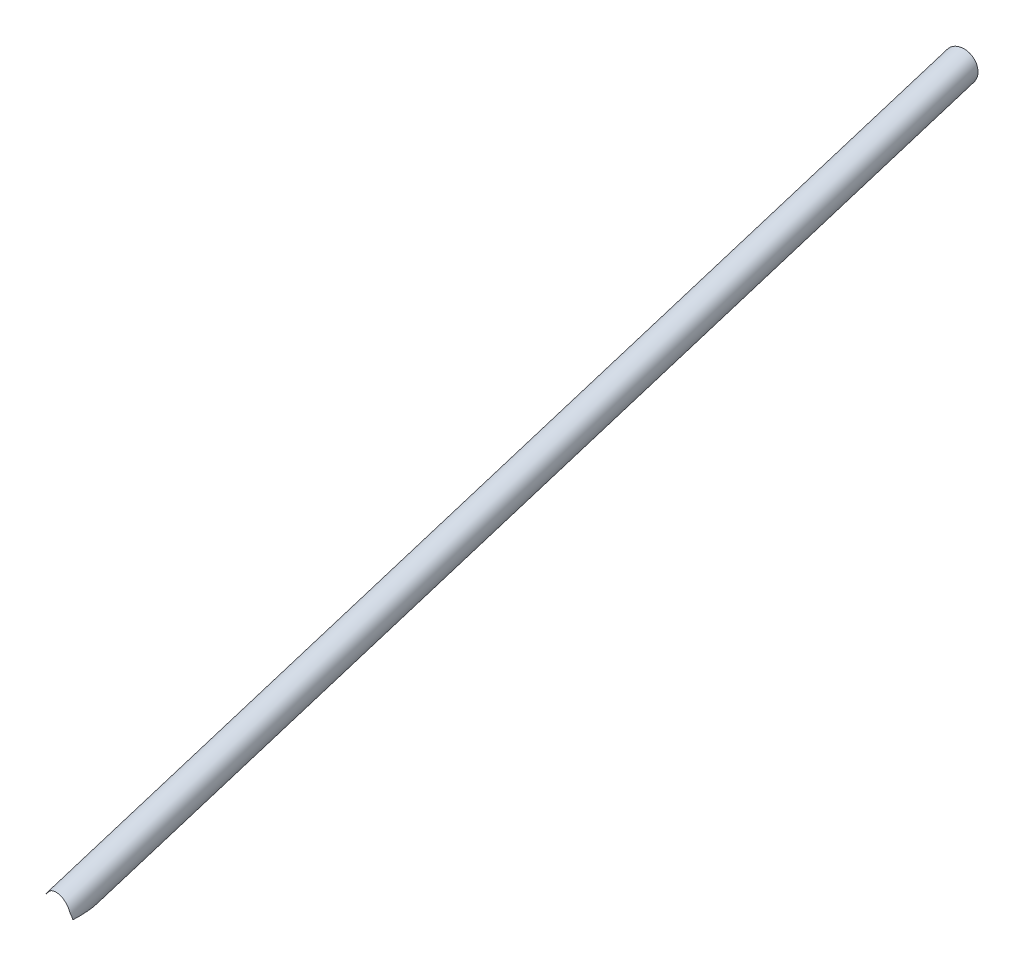
ISO-10303-21;
HEADER;
FILE_DESCRIPTION(('STEP AP214'),'2;1');
FILE_NAME('part.step','',(''),(''),'','','');
FILE_SCHEMA(('AUTOMOTIVE_DESIGN { 1 0 10303 214 1 1 1 1 }'));
ENDSEC;
DATA;
#1=APPLICATION_CONTEXT('core data for automotive mechanical design processes');
#2=APPLICATION_PROTOCOL_DEFINITION('international standard','automotive_design',2000,#1);
#3=PRODUCT_CONTEXT('',#1,'mechanical');
#4=PRODUCT('Part','Part','',(#3));
#5=PRODUCT_RELATED_PRODUCT_CATEGORY('part','',(#4));
#6=PRODUCT_DEFINITION_FORMATION('','',#4);
#7=PRODUCT_DEFINITION_CONTEXT('part definition',#1,'design');
#8=PRODUCT_DEFINITION('design','',#6,#7);
#9=PRODUCT_DEFINITION_SHAPE('','',#8);
#10=(LENGTH_UNIT() NAMED_UNIT(*) SI_UNIT(.MILLI.,.METRE.));
#11=(NAMED_UNIT(*) PLANE_ANGLE_UNIT() SI_UNIT($,.RADIAN.));
#12=(NAMED_UNIT(*) SI_UNIT($,.STERADIAN.) SOLID_ANGLE_UNIT());
#13=UNCERTAINTY_MEASURE_WITH_UNIT(LENGTH_MEASURE(1.E-05),#10,'distance_accuracy_value','');
#14=(GEOMETRIC_REPRESENTATION_CONTEXT(3) GLOBAL_UNCERTAINTY_ASSIGNED_CONTEXT((#13)) GLOBAL_UNIT_ASSIGNED_CONTEXT((#10,
#11,#12)) REPRESENTATION_CONTEXT('',''));
#15=CARTESIAN_POINT('',(0.,0.,0.));
#16=DIRECTION('',(0.,0.,1.));
#17=DIRECTION('',(1.,0.,0.));
#18=AXIS2_PLACEMENT_3D('',#15,#16,#17);
#19=CARTESIAN_POINT('',(-160.,500.,-1140.));
#20=DIRECTION('',(-0.0860700691861797,-0.397246473166983,0.913666888284061));
#21=DIRECTION('',(0.,-0.917070056253235,-0.39872611141445));
#22=AXIS2_PLACEMENT_3D('',#19,#20,#21);
#23=CYLINDRICAL_SURFACE('',#22,11.3);
#24=CARTESIAN_POINT('',(-160.,500.,-1140.));
#25=DIRECTION('',(-0.133991346812806,0.0219122293107186,-0.990740214781819));
#26=DIRECTION('',(-0.480296136468892,-0.875921056969801,0.0455842434396289));
#27=AXIS2_PLACEMENT_3D('',#24,#25,#26);
#28=ELLIPSE('',#27,12.5224622988998,11.3);
#29=CARTESIAN_POINT('',(-166.014490261239,489.031311587283,-1139.4291730301));
#30=VERTEX_POINT('',#29);
#31=EDGE_CURVE('E103',#30,#30,#28,.T.);
#32=ORIENTED_EDGE('',*,*,#31,.T.);
#33=EDGE_LOOP('',(#32));
#34=FACE_BOUND('',#33,.T.);
#35=CARTESIAN_POINT('',(-219.876049960594,213.286108546211,-508.89830547729));
#36=CARTESIAN_POINT('',(-219.744983221446,213.103990623124,-508.47944079388));
#37=CARTESIAN_POINT('',(-219.619745346317,212.924703354233,-508.057517587089));
#38=CARTESIAN_POINT('',(-219.378911944815,212.570958780361,-507.208904454206));
#39=CARTESIAN_POINT('',(-219.26331728065,212.396501908199,-506.78221410574));
#40=CARTESIAN_POINT('',(-219.04028242253,212.051767564359,-505.924884196033));
#41=CARTESIAN_POINT('',(-218.932844658474,211.881491348218,-505.494243500491));
#42=CARTESIAN_POINT('',(-218.725033339016,211.544695304599,-504.629791739642));
#43=CARTESIAN_POINT('',(-218.624660021078,211.378175603521,-504.195980568303));
#44=CARTESIAN_POINT('',(-218.429946994662,211.048271186261,-503.32501231813));
#45=CARTESIAN_POINT('',(-218.335616992411,210.884891794424,-502.887851059884));
#46=CARTESIAN_POINT('',(-218.152456909951,210.561245639945,-502.011227040914));
#47=CARTESIAN_POINT('',(-218.063626926709,210.400978932214,-501.571764239762));
#48=CARTESIAN_POINT('',(-217.804525528881,209.924546692681,-500.250546260107));
#49=CARTESIAN_POINT('',(-217.641605085443,209.612684743305,-499.36579097204));
#50=CARTESIAN_POINT('',(-217.332053099736,208.999574907086,-497.591341510518));
#51=CARTESIAN_POINT('',(-217.185397533481,208.698311827055,-496.701656715531));
#52=CARTESIAN_POINT('',(-216.905547759232,208.105089343523,-494.917054244897));
#53=CARTESIAN_POINT('',(-216.772354080109,207.813130305853,-494.022136365121));
#54=CARTESIAN_POINT('',(-216.517570444801,207.238328944722,-492.228559205508));
#55=CARTESIAN_POINT('',(-216.395971147722,206.955479406063,-491.329903556707));
#56=CARTESIAN_POINT('',(-216.162677298762,206.398554053049,-489.528621906422));
#57=CARTESIAN_POINT('',(-216.050982567507,206.12447807986,-488.62599597715));
#58=CARTESIAN_POINT('',(-215.800126001738,205.494892970526,-486.513748016538));
#59=CARTESIAN_POINT('',(-215.664313620349,205.142896406478,-485.302680033244));
#60=CARTESIAN_POINT('',(-215.405081735264,204.456347723635,-482.874033184217));
#61=CARTESIAN_POINT('',(-215.281664565608,204.121798895961,-481.656453137545));
#62=CARTESIAN_POINT('',(-215.103815080915,203.635712769231,-479.825583797999));
#63=CARTESIAN_POINT('',(-215.04575991263,203.476349455546,-479.214716304721));
#64=CARTESIAN_POINT('',(-214.931688797713,203.163516169446,-477.991286220898));
#65=CARTESIAN_POINT('',(-214.875672833209,203.010046145387,-477.378723645257));
#66=CARTESIAN_POINT('',(-214.765285206241,202.709902179022,-476.151867048996));
#67=CARTESIAN_POINT('',(-214.710913337557,202.563227383148,-475.537573256179));
#68=CARTESIAN_POINT('',(-214.603355653244,202.277887615788,-474.307030949214));
#69=CARTESIAN_POINT('',(-214.550169817021,202.139222505161,-473.690782469218));
#70=CARTESIAN_POINT('',(-214.441261806551,201.86349359177,-472.418706701254));
#71=CARTESIAN_POINT('',(-214.385581197601,201.72703582032,-471.762743573419));
#72=CARTESIAN_POINT('',(-214.274236447711,201.467961415602,-470.44798998492));
#73=CARTESIAN_POINT('',(-214.218572309512,201.34534642842,-469.789199197659));
#74=CARTESIAN_POINT('',(-214.106383579729,201.118258951356,-468.468202374617));
#75=CARTESIAN_POINT('',(-214.049858632288,201.013794199088,-467.805995005582));
#76=CARTESIAN_POINT('',(-213.963740687105,200.875921294725,-466.810249309681));
#77=CARTESIAN_POINT('',(-213.934815471176,200.833103875561,-466.477956704485));
#78=CARTESIAN_POINT('',(-213.876406404185,200.754984265097,-465.812545122427));
#79=CARTESIAN_POINT('',(-213.846922580454,200.719681707149,-465.479426186685));
#80=CARTESIAN_POINT('',(-213.782106010479,200.652727034682,-464.754274182321));
#81=CARTESIAN_POINT('',(-213.746649318281,200.622782938346,-464.362089961271));
#82=CARTESIAN_POINT('',(-213.674779088304,200.578554440055,-463.576958501132));
#83=CARTESIAN_POINT('',(-213.638365751688,200.564266772439,-463.184011438295));
#84=CARTESIAN_POINT('',(-213.56474936776,200.555655415265,-462.398044000887));
#85=CARTESIAN_POINT('',(-213.527546605193,200.561324644988,-462.005023701781));
#86=CARTESIAN_POINT('',(-213.452948517691,200.598298999997,-461.220186184778));
#87=CARTESIAN_POINT('',(-213.415553282612,200.629593080746,-460.82836852155));
#88=CARTESIAN_POINT('',(-213.354377838602,200.709052667958,-460.178870506829));
#89=CARTESIAN_POINT('',(-213.330223675209,200.748086090363,-459.92011812872));
#90=CARTESIAN_POINT('',(-213.283333653861,200.843111386252,-459.405548398941));
#91=CARTESIAN_POINT('',(-213.260597780996,200.899103081427,-459.14973101644));
#92=CARTESIAN_POINT('',(-213.217805694454,201.030237533156,-458.643442794107));
#93=CARTESIAN_POINT('',(-213.197742930547,201.105332113742,-458.392960197588));
#94=CARTESIAN_POINT('',(-213.161904914827,201.276685163148,-457.898998284789));
#95=CARTESIAN_POINT('',(-213.146128592518,201.372938336937,-457.655517233551));
#96=CARTESIAN_POINT('',(-213.122904089955,201.571136150238,-457.214801378819));
#97=CARTESIAN_POINT('',(-213.11454948026,201.669941378793,-457.016202982964));
#98=CARTESIAN_POINT('',(-213.10386721278,201.88328298806,-456.627486220911));
#99=CARTESIAN_POINT('',(-213.101538519408,201.997816662184,-456.437366403139));
#100=CARTESIAN_POINT('',(-213.104358206987,202.241754215438,-456.066871162022));
#101=CARTESIAN_POINT('',(-213.109509415052,202.371163700022,-455.886499449812));
#102=CARTESIAN_POINT('',(-213.128625571324,202.643204004896,-455.536511931585));
#103=CARTESIAN_POINT('',(-213.1425909708,202.785835501808,-455.366896676765));
#104=CARTESIAN_POINT('',(-213.180368446752,203.081676791198,-455.039472386284));
#105=CARTESIAN_POINT('',(-213.20414476173,203.234846498735,-454.881622905517));
#106=CARTESIAN_POINT('',(-213.26235586334,203.549931764342,-454.577037676503));
#107=CARTESIAN_POINT('',(-213.296790793106,203.711847439836,-454.430302077536));
#108=CARTESIAN_POINT('',(-213.376900000913,204.042282466348,-454.147467958357));
#109=CARTESIAN_POINT('',(-213.42258383392,204.210807328447,-454.011378611384));
#110=CARTESIAN_POINT('',(-213.525491295265,204.552196973546,-453.749406483292));
#111=CARTESIAN_POINT('',(-213.582715572356,204.725062000053,-453.623524276533));
#112=CARTESIAN_POINT('',(-213.715474718343,205.091527176439,-453.368566218417));
#113=CARTESIAN_POINT('',(-213.792302821077,205.285394900929,-453.240548516363));
#114=CARTESIAN_POINT('',(-213.960186462241,205.673780980482,-452.995306225191));
#115=CARTESIAN_POINT('',(-214.051242665361,205.868299365527,-452.878082140723));
#116=CARTESIAN_POINT('',(-214.24740563176,206.256039630434,-452.653602138816));
#117=CARTESIAN_POINT('',(-214.352514726597,206.449261289553,-452.546347880517));
#118=CARTESIAN_POINT('',(-214.576461082975,206.832671651858,-452.341130201842));
#119=CARTESIAN_POINT('',(-214.695299819786,207.022860026609,-452.24316778195));
#120=CARTESIAN_POINT('',(-214.969723631708,207.433775928185,-452.038495134482));
#121=CARTESIAN_POINT('',(-215.128027671311,207.653579840005,-451.933563536698));
#122=CARTESIAN_POINT('',(-215.462555499854,208.084610761703,-451.735254015726));
#123=CARTESIAN_POINT('',(-215.638781158982,208.29583687323,-451.641877300594));
#124=CARTESIAN_POINT('',(-216.008251037447,208.707902448154,-451.466130738983));
#125=CARTESIAN_POINT('',(-216.201502624309,208.90873735477,-451.383765696713));
#126=CARTESIAN_POINT('',(-216.603858336084,209.29826890404,-451.229760059687));
#127=CARTESIAN_POINT('',(-216.812962772296,209.486965308197,-451.15811967561));
#128=CARTESIAN_POINT('',(-217.261572552873,209.864018482549,-451.02055888517));
#129=CARTESIAN_POINT('',(-217.502182865505,210.051352624773,-450.955433322352));
#130=CARTESIAN_POINT('',(-217.998649508044,210.408864902307,-450.837279822074));
#131=CARTESIAN_POINT('',(-218.254506663411,210.579042107401,-450.784252540361));
#132=CARTESIAN_POINT('',(-218.779730460772,210.900950763227,-450.690413896198));
#133=CARTESIAN_POINT('',(-219.04909782561,211.052681225502,-450.649603188194));
#134=CARTESIAN_POINT('',(-219.599465829415,211.33662690283,-450.580466933131));
#135=CARTESIAN_POINT('',(-219.880466404608,211.468842224848,-450.552141317638));
#136=CARTESIAN_POINT('',(-220.456010448877,211.714596131859,-450.508087907376));
#137=CARTESIAN_POINT('',(-220.75068576435,211.827857624966,-450.492535861839));
#138=CARTESIAN_POINT('',(-221.347817510827,212.032907671322,-450.475264989343));
#139=CARTESIAN_POINT('',(-221.650274095314,212.124695800655,-450.473546435457));
#140=CARTESIAN_POINT('',(-222.26080600569,212.286519022599,-450.48471478705));
#141=CARTESIAN_POINT('',(-222.568883293567,212.356546359303,-450.497606892421));
#142=CARTESIAN_POINT('',(-223.188157389216,212.474806432573,-450.538989165288));
#143=CARTESIAN_POINT('',(-223.499354130811,212.523039630491,-450.567479002573));
#144=CARTESIAN_POINT('',(-224.12088345176,212.597898177508,-450.64112373476));
#145=CARTESIAN_POINT('',(-224.431213254372,212.624623647218,-450.686199971337));
#146=CARTESIAN_POINT('',(-225.049820005669,212.657613314589,-450.794560798362));
#147=CARTESIAN_POINT('',(-225.358096786274,212.66387585703,-450.857846861327));
#148=CARTESIAN_POINT('',(-225.96944806192,212.657219053458,-451.004432400901));
#149=CARTESIAN_POINT('',(-226.272525862467,212.644312389888,-451.087718614753));
#150=CARTESIAN_POINT('',(-226.870404952932,212.601255073978,-451.2765081922));
#151=CARTESIAN_POINT('',(-227.165208652532,212.571109497994,-451.382005009647));
#152=CARTESIAN_POINT('',(-227.673500017961,212.505324655486,-451.589314604247));
#153=CARTESIAN_POINT('',(-227.889515928935,212.472742550823,-451.685929545593));
#154=CARTESIAN_POINT('',(-228.312869229701,212.400816261149,-451.894413233523));
#155=CARTESIAN_POINT('',(-228.520208673324,212.361473687815,-452.006278343197));
#156=CARTESIAN_POINT('',(-228.924018267572,212.278012958143,-452.245967320095));
#157=CARTESIAN_POINT('',(-229.120504940473,212.233902381371,-452.373765906518));
#158=CARTESIAN_POINT('',(-229.501018247845,212.143096251854,-452.645970708164));
#159=CARTESIAN_POINT('',(-229.685044948172,212.096400712774,-452.790376835595));
#160=CARTESIAN_POINT('',(-230.039950544015,212.002572701807,-453.096678874909));
#161=CARTESIAN_POINT('',(-230.210738942004,211.955439334162,-453.258679607883));
#162=CARTESIAN_POINT('',(-230.536414417563,211.863507485884,-453.598532634346));
#163=CARTESIAN_POINT('',(-230.691302584016,211.818708845466,-453.7763838408));
#164=CARTESIAN_POINT('',(-230.984363659839,211.733624574822,-454.146228168456));
#165=CARTESIAN_POINT('',(-231.122543057678,211.693337193203,-454.338215753218));
#166=CARTESIAN_POINT('',(-231.382315097609,211.618843312766,-454.734200413158));
#167=CARTESIAN_POINT('',(-231.503905120753,211.584637773824,-454.938199377301));
#168=CARTESIAN_POINT('',(-231.761099371245,211.515199665562,-455.410565327683));
#169=CARTESIAN_POINT('',(-231.892020340293,211.482048927363,-455.681786107978));
#170=CARTESIAN_POINT('',(-232.131475932484,211.427406034395,-456.235023458243));
#171=CARTESIAN_POINT('',(-232.240001267101,211.405918710994,-456.51704445031));
#172=CARTESIAN_POINT('',(-232.438393944241,211.373905980006,-457.089399075528));
#173=CARTESIAN_POINT('',(-232.528182925639,211.363425899724,-457.379762061718));
#174=CARTESIAN_POINT('',(-232.6508718246,211.355163750562,-457.81865466125));
#175=CARTESIAN_POINT('',(-232.689766290868,211.353652511594,-457.965497854941));
#176=CARTESIAN_POINT('',(-232.763933776339,211.35294725027,-458.260100417196));
#177=CARTESIAN_POINT('',(-232.799206878432,211.353753174864,-458.407859764709));
#178=CARTESIAN_POINT('',(-232.898956968056,211.359333938033,-458.847094997615));
#179=CARTESIAN_POINT('',(-232.958752086128,211.36718930066,-459.139600372026));
#180=CARTESIAN_POINT('',(-233.067959774756,211.390003750907,-459.726295039152));
#181=CARTESIAN_POINT('',(-233.117369612658,211.404964704837,-460.020484754197));
#182=CARTESIAN_POINT('',(-233.207634738172,211.44092509074,-460.610060650924));
#183=CARTESIAN_POINT('',(-233.248482262542,211.461929962004,-460.905447672992));
#184=CARTESIAN_POINT('',(-233.323009212711,211.509041371656,-461.49673207333));
#185=CARTESIAN_POINT('',(-233.356687921201,211.535148420064,-461.792629499688));
#186=CARTESIAN_POINT('',(-233.418128182977,211.591776210706,-462.385717469772));
#187=CARTESIAN_POINT('',(-233.445867501769,211.622312844022,-462.682908764538));
#188=CARTESIAN_POINT('',(-233.496181181045,211.687063955323,-463.277333044717));
#189=CARTESIAN_POINT('',(-233.518755299116,211.721278605814,-463.574566031432));
#190=CARTESIAN_POINT('',(-233.579838921726,211.828536277851,-464.465830359774));
#191=CARTESIAN_POINT('',(-233.611742062854,211.906225804204,-465.059756806261));
#192=CARTESIAN_POINT('',(-233.662444316878,212.071454141046,-466.253551077762));
#193=CARTESIAN_POINT('',(-233.681092163745,212.15909381083,-466.853410677472));
#194=CARTESIAN_POINT('',(-233.707515436677,212.341013587603,-468.052409163508));
#195=CARTESIAN_POINT('',(-233.715289748475,212.435294374101,-468.651547969685));
#196=CARTESIAN_POINT('',(-233.72186796692,212.628411315201,-469.847546012818));
#197=CARTESIAN_POINT('',(-233.720694889313,212.727235132369,-470.444407149835));
#198=CARTESIAN_POINT('',(-233.710731413022,212.928312336584,-471.637458585724));
#199=CARTESIAN_POINT('',(-233.701941290651,213.030565599097,-472.233648908145));
#200=CARTESIAN_POINT('',(-233.674638124659,213.263199763677,-473.573692386008));
#201=CARTESIAN_POINT('',(-233.654250548522,213.394250937519,-474.317390404706));
#202=CARTESIAN_POINT('',(-233.604210377443,213.658555763707,-475.804090365284));
#203=CARTESIAN_POINT('',(-233.57455761012,213.791809456988,-476.547092293955));
#204=CARTESIAN_POINT('',(-233.506713255288,214.059362450023,-478.032601468238));
#205=CARTESIAN_POINT('',(-233.468520715025,214.19366186483,-478.775108649374));
#206=CARTESIAN_POINT('',(-233.384022907988,214.462349675476,-480.259645440088));
#207=CARTESIAN_POINT('',(-233.337717624666,214.596738071497,-481.001675048689));
#208=CARTESIAN_POINT('',(-233.23705232181,214.865163734284,-482.487269226921));
#209=CARTESIAN_POINT('',(-233.182671502715,214.999199156703,-483.23083272034));
#210=CARTESIAN_POINT('',(-233.065945158307,215.265858764713,-484.717590001092));
#211=CARTESIAN_POINT('',(-233.003599614629,215.39848294705,-485.460783787569));
#212=CARTESIAN_POINT('',(-232.870784556801,215.661639775474,-486.946686382016));
#213=CARTESIAN_POINT('',(-232.800316420251,215.792172771963,-487.689395250805));
#214=CARTESIAN_POINT('',(-232.650911222236,216.050521758656,-489.174433901681));
#215=CARTESIAN_POINT('',(-232.571974183699,216.178337756215,-489.91676368479));
#216=CARTESIAN_POINT('',(-232.405997094246,216.429247095675,-491.393161764116));
#217=CARTESIAN_POINT('',(-232.319051346964,216.552376041772,-492.12723457239));
#218=CARTESIAN_POINT('',(-232.135666425885,216.794595631622,-493.594871135811));
#219=CARTESIAN_POINT('',(-232.039227163591,216.913686237717,-494.328434886148));
#220=CARTESIAN_POINT('',(-231.835859075345,217.147068032404,-495.795314815178));
#221=CARTESIAN_POINT('',(-231.728924380142,217.261356483935,-496.528630622571));
#222=CARTESIAN_POINT('',(-231.559733099131,217.428373284607,-497.627902986775));
#223=CARTESIAN_POINT('',(-231.50187221928,217.483308651539,-497.994203828255));
#224=CARTESIAN_POINT('',(-231.383010793059,217.591556604716,-498.726550148446));
#225=CARTESIAN_POINT('',(-231.32201012911,217.644869130069,-499.092595617073));
#226=CARTESIAN_POINT('',(-231.134379451448,217.801775788718,-500.187839717358));
#227=CARTESIAN_POINT('',(-231.002750007655,217.902709897204,-500.916573910206));
#228=CARTESIAN_POINT('',(-230.723807984759,218.095804030167,-502.372201021307));
#229=CARTESIAN_POINT('',(-230.576496253824,218.18796452865,-503.099094036964));
#230=CARTESIAN_POINT('',(-230.341258828971,218.317789344898,-504.187013082739));
#231=CARTESIAN_POINT('',(-230.260505688899,218.359645499576,-504.549094779759));
#232=CARTESIAN_POINT('',(-230.09363711832,218.440159769348,-505.272373434714));
#233=CARTESIAN_POINT('',(-230.007521833855,218.478817971474,-505.633570416468));
#234=CARTESIAN_POINT('',(-229.829239377808,218.552434004729,-506.354757749535));
#235=CARTESIAN_POINT('',(-229.737073662493,218.587392721027,-506.714748369441));
#236=CARTESIAN_POINT('',(-229.545771458467,218.652986347644,-507.433259683284));
#237=CARTESIAN_POINT('',(-229.446635426591,218.683621540931,-507.791780471927));
#238=CARTESIAN_POINT('',(-229.291543538393,218.725775244305,-508.329023847385));
#239=CARTESIAN_POINT('',(-229.238636560044,218.739223085243,-508.508478317709));
#240=CARTESIAN_POINT('',(-229.13056806981,218.764679329674,-508.866817029774));
#241=CARTESIAN_POINT('',(-229.075406494451,218.776687692602,-509.045701255307));
#242=CARTESIAN_POINT('',(-228.962610266027,218.799111549977,-509.402810622901));
#243=CARTESIAN_POINT('',(-228.904975368901,218.809526886764,-509.581035698026));
#244=CARTESIAN_POINT('',(-228.786980473434,218.82857550834,-509.936674600624));
#245=CARTESIAN_POINT('',(-228.726620488743,218.837208802053,-510.114088432156));
#246=CARTESIAN_POINT('',(-228.541378459207,218.860073256708,-510.643852842777));
#247=CARTESIAN_POINT('',(-228.412003318519,218.871337860013,-510.994786497656));
#248=CARTESIAN_POINT('',(-228.138108646116,218.88362145627,-511.691099839771));
#249=CARTESIAN_POINT('',(-227.993585551798,218.884638033529,-512.036478198344));
#250=CARTESIAN_POINT('',(-227.720217690952,218.874054284759,-512.639560686214));
#251=CARTESIAN_POINT('',(-227.595426719919,218.865305543662,-512.899138984596));
#252=CARTESIAN_POINT('',(-227.330868774635,218.836863979322,-513.409855091268));
#253=CARTESIAN_POINT('',(-227.191117440987,218.817182497441,-513.661001360906));
#254=CARTESIAN_POINT('',(-226.96570364798,218.776135237482,-514.028980822406));
#255=CARTESIAN_POINT('',(-226.887383491885,218.76039388374,-514.150933049965));
#256=CARTESIAN_POINT('',(-226.724842869676,218.724227538574,-514.390090346898));
#257=CARTESIAN_POINT('',(-226.640625090911,218.703804670836,-514.507297540496));
#258=CARTESIAN_POINT('',(-226.465626505456,218.657370979251,-514.73494509584));
#259=CARTESIAN_POINT('',(-226.374869733584,218.631379989511,-514.845407732768));
#260=CARTESIAN_POINT('',(-226.185616160805,218.572572047718,-515.057435896979));
#261=CARTESIAN_POINT('',(-226.087128865207,218.539763399187,-515.159012035621));
#262=CARTESIAN_POINT('',(-225.887583151127,218.468075043259,-515.344115120625));
#263=CARTESIAN_POINT('',(-225.787026918143,218.429673087393,-515.428356611581));
#264=CARTESIAN_POINT('',(-225.578098516825,218.344410866555,-515.581676829108));
#265=CARTESIAN_POINT('',(-225.469731122944,218.297555742565,-515.650764715405));
#266=CARTESIAN_POINT('',(-225.24486914268,218.194108962291,-515.769455500597));
#267=CARTESIAN_POINT('',(-225.128291355927,218.137405215095,-515.81880971172));
#268=CARTESIAN_POINT('',(-224.891653461684,218.015473815941,-515.891928186345));
#269=CARTESIAN_POINT('',(-224.771598487589,217.950258276177,-515.915728377148));
#270=CARTESIAN_POINT('',(-224.546753675124,217.821738743551,-515.935020852198));
#271=CARTESIAN_POINT('',(-224.441820929242,217.759103503046,-515.93349879478));
#272=CARTESIAN_POINT('',(-224.235754975396,217.631159305576,-515.910925673853));
#273=CARTESIAN_POINT('',(-224.134625832246,217.565847635819,-515.889854302805));
#274=CARTESIAN_POINT('',(-223.897051153364,217.407033793416,-515.819013470719));
#275=CARTESIAN_POINT('',(-223.763410388923,217.313104476599,-515.760953187223));
#276=CARTESIAN_POINT('',(-223.508329690046,217.126489274661,-515.62103696864));
#277=CARTESIAN_POINT('',(-223.386922914465,217.033807329173,-515.539118586312));
#278=CARTESIAN_POINT('',(-223.163064484588,216.857037200738,-515.364722389961));
#279=CARTESIAN_POINT('',(-223.059888796202,216.772787945359,-515.273312193302));
#280=CARTESIAN_POINT('',(-222.861869264644,216.606573217881,-515.079892094486));
#281=CARTESIAN_POINT('',(-222.767033471414,216.524610003327,-514.977872154285));
#282=CARTESIAN_POINT('',(-222.584286948219,216.362766642182,-514.765735157854));
#283=CARTESIAN_POINT('',(-222.496394364576,216.28289229676,-514.655598249615));
#284=CARTESIAN_POINT('',(-222.326758274866,216.12530563215,-514.429357834897));
#285=CARTESIAN_POINT('',(-222.245012167026,216.047592407049,-514.313256888397));
#286=CARTESIAN_POINT('',(-222.036280997918,215.845176059628,-514.000883181949));
#287=CARTESIAN_POINT('',(-221.913657233436,215.722081473246,-513.800660886901));
#288=CARTESIAN_POINT('',(-221.679346838073,215.480204968263,-513.391347236505));
#289=CARTESIAN_POINT('',(-221.567666379901,215.36142550716,-513.182250969888));
#290=CARTESIAN_POINT('',(-221.35302430248,215.127364668617,-512.757156898563));
#291=CARTESIAN_POINT('',(-221.250079083864,215.012090121112,-512.541147116467));
#292=CARTESIAN_POINT('',(-221.051588289963,214.784733132142,-512.104099561519));
#293=CARTESIAN_POINT('',(-220.956043553812,214.672651053576,-511.88306122215));
#294=CARTESIAN_POINT('',(-220.77078752493,214.450767173306,-511.436002431829));
#295=CARTESIAN_POINT('',(-220.681104947255,214.340978163244,-511.209963802172));
#296=CARTESIAN_POINT('',(-220.507150532681,214.123870054837,-510.75463922907));
#297=CARTESIAN_POINT('',(-220.422878925858,214.016551061642,-510.525353148049));
#298=CARTESIAN_POINT('',(-220.25914494252,213.804244739221,-510.064387661736));
#299=CARTESIAN_POINT('',(-220.179676736866,213.699254685868,-509.832711573673));
#300=CARTESIAN_POINT('',(-220.024878075468,213.491249251484,-509.367112717204));
#301=CARTESIAN_POINT('',(-219.949547554511,213.388233839347,-509.133189984277));
#302=CARTESIAN_POINT('',(-219.876049960594,213.286108546211,-508.89830547729));
#303=B_SPLINE_CURVE_WITH_KNOTS('',3,(#35,#36,#37,#38,#39,#40,#41,#42,#43,#44,#45,#46,#47,#48,
#49,#50,#51,#52,#53,#54,#55,#56,#57,#58,#59,#60,#61,#62,#63,#64,#65,#66,#67,#68,#69,#70,#71,#72,
#73,#74,#75,#76,#77,#78,#79,#80,#81,#82,#83,#84,#85,#86,#87,#88,#89,#90,#91,#92,#93,#94,#95,#96,
#97,#98,#99,#100,#101,#102,#103,#104,#105,#106,#107,#108,#109,#110,#111,#112,#113,#114,#115,
#116,#117,#118,#119,#120,#121,#122,#123,#124,#125,#126,#127,#128,#129,#130,#131,#132,#133,#134,
#135,#136,#137,#138,#139,#140,#141,#142,#143,#144,#145,#146,#147,#148,#149,#150,#151,#152,#153,
#154,#155,#156,#157,#158,#159,#160,#161,#162,#163,#164,#165,#166,#167,#168,#169,#170,#171,#172,
#173,#174,#175,#176,#177,#178,#179,#180,#181,#182,#183,#184,#185,#186,#187,#188,#189,#190,#191,
#192,#193,#194,#195,#196,#197,#198,#199,#200,#201,#202,#203,#204,#205,#206,#207,#208,#209,#210,
#211,#212,#213,#214,#215,#216,#217,#218,#219,#220,#221,#222,#223,#224,#225,#226,#227,#228,#229,
#230,#231,#232,#233,#234,#235,#236,#237,#238,#239,#240,#241,#242,#243,#244,#245,#246,#247,#248,
#249,#250,#251,#252,#253,#254,#255,#256,#257,#258,#259,#260,#261,#262,#263,#264,#265,#266,#267,
#268,#269,#270,#271,#272,#273,#274,#275,#276,#277,#278,#279,#280,#281,#282,#283,#284,#285,#286,
#287,#288,#289,#290,#291,#292,#293,#294,#295,#296,#297,#298,#299,#300,#301,#302),.UNSPECIFIED.,
.T.,.F.,(4,2,2,2,2,2,2,2,2,2,2,2,2,2,2,2,2,2,2,2,2,2,2,2,2,2,2,2,2,2,2,2,2,2,2,2,2,2,2,2,2,2,2,
2,2,2,2,2,2,2,2,2,2,2,2,2,2,2,2,2,2,2,2,2,2,2,2,2,2,2,2,2,2,2,2,2,2,2,2,2,2,2,2,2,2,2,2,2,2,2,2,
2,2,2,2,2,2,2,2,2,2,2,2,2,2,2,2,2,2,2,2,2,2,2,2,2,2,2,2,2,2,2,2,2,2,2,2,2,2,2,2,2,2,4),(0.,
1.42550520256903,2.85113772438494,4.27719328209503,5.70329675259689,7.13163607219715,
8.56000056673993,11.416171468125,14.2680658492208,17.1200722277927,19.9697611512101,
22.8193984554201,26.6246255259533,30.4305677893046,32.3324710976561,34.2343577350124,
36.1360048196505,38.037618859877,40.0544463128961,42.0715133407219,44.0894381643301,
45.0982287806469,46.1069701671947,47.2914869307738,48.4757565775088,49.6596060870945,
50.8429456155277,51.6308622718823,52.4187706439213,53.2047113386978,53.9904555718202,
54.6556364644059,55.3207030341794,55.9860210387768,56.65137310903,57.3143210513034,
57.9772778966032,58.6407998205345,59.3043590551963,60.0377525569968,60.7711803308199,
61.5047299412353,62.2383584461522,63.1088810369283,63.979494563446,64.8504866931494,
65.7214959307785,66.655847021867,67.5902487444707,68.5247005143498,69.4591471621602,
70.4062449421141,71.3533614177051,72.3008150751634,73.2482486753191,74.1912459439292,
75.1343194884045,76.0767693685471,77.0189418676236,77.7348848650089,78.4506574196648,
79.1653084138453,79.8799556304269,80.5991218619035,81.3182388103531,82.0370756031684,
82.7560257471248,83.6634645234139,84.5712789042905,85.4828171374025,85.9385104148683,
86.3941932596094,87.2898025074421,88.1856471205388,89.082300494096,89.979043544317,
90.8790870849542,91.7791728576665,93.5783462418055,95.3977353293845,97.2173108452689,
99.032207371966,100.847038064837,103.113259863534,105.379523828562,107.646040759275,
109.912562313052,112.185026217991,114.457495362913,116.729579660721,119.001657807203,
121.249758327142,123.497879805255,125.747265718739,126.871919407668,127.996615243181,
130.23855666926,132.480376902839,133.600328018605,134.720248644809,135.839900700619,
136.959479442353,137.522184305173,138.084905021161,138.647681393319,139.210454947125,
140.332665930105,141.455141437422,142.319126595942,143.182217146328,143.619374481488,
144.056333898885,144.491761969754,144.926662789894,145.335670763841,145.744430823918,
146.158191036846,146.571368764841,146.936214981566,147.301440620032,147.818565598927,
148.337056478577,148.820991593192,149.305388805204,149.791012777018,150.276430015607,
151.071127849487,151.866271392899,152.662876246658,153.459571294898,154.259914458357,
155.060291629983,155.859677156812,156.659050080752),.UNSPECIFIED.);
#304=CARTESIAN_POINT('',(-227.58896296901,212.515684786377,-451.555922832177));
#305=VERTEX_POINT('',#304);
#306=CARTESIAN_POINT('',(-214.357776615298,201.662909535805,-471.434286069236));
#307=VERTEX_POINT('',#306);
#308=EDGE_CURVE('E98',#305,#307,#303,.T.);
#309=ORIENTED_EDGE('',*,*,#308,.T.);
#310=CARTESIAN_POINT('',(-222.412475974722,201.579526942545,-481.973167788858));
#311=CARTESIAN_POINT('',(-222.283580635374,201.580903596763,-481.976335723639));
#312=CARTESIAN_POINT('',(-222.15455608831,201.582236741058,-481.973924250168));
#313=CARTESIAN_POINT('',(-221.897178202608,201.584803574509,-481.957767395474));
#314=CARTESIAN_POINT('',(-221.768825034472,201.586037239448,-481.944019263641));
#315=CARTESIAN_POINT('',(-221.513762511361,201.588395922724,-481.90529714411));
#316=CARTESIAN_POINT('',(-221.387053921572,201.589520891952,-481.880318110881));
#317=CARTESIAN_POINT('',(-221.136229733097,201.591657433709,-481.819575912498));
#318=CARTESIAN_POINT('',(-221.012115201896,201.592668960275,-481.783808397676));
#319=CARTESIAN_POINT('',(-220.646396864996,201.595520490956,-481.661772048453));
#320=CARTESIAN_POINT('',(-220.409670715362,201.597193436428,-481.560491148433));
#321=CARTESIAN_POINT('',(-219.953661087556,201.600135992599,-481.324858517729));
#322=CARTESIAN_POINT('',(-219.734388294754,201.601405357618,-481.190486730951));
#323=CARTESIAN_POINT('',(-219.175441704701,201.604363701614,-480.798664029497));
#324=CARTESIAN_POINT('',(-218.851675350488,201.60577775405,-480.518467318853));
#325=CARTESIAN_POINT('',(-218.40099107334,201.607565711883,-480.064477965052));
#326=CARTESIAN_POINT('',(-218.25634290905,201.608106905403,-479.907192772675));
#327=CARTESIAN_POINT('',(-217.977695150815,201.609125297076,-479.583427187781));
#328=CARTESIAN_POINT('',(-217.843693486865,201.609602507681,-479.416948593465));
#329=CARTESIAN_POINT('',(-217.469512026519,201.610956037361,-478.923941334853));
#330=CARTESIAN_POINT('',(-217.241957072985,201.611806226427,-478.587847179625));
#331=CARTESIAN_POINT('',(-216.81591753446,201.613688980633,-477.89763833586));
#332=CARTESIAN_POINT('',(-216.617460991645,201.614721719612,-477.543506701575));
#333=CARTESIAN_POINT('',(-216.244651747612,201.617189766064,-476.821787785619));
#334=CARTESIAN_POINT('',(-216.070359120655,201.618626050914,-476.45416974341));
#335=CARTESIAN_POINT('',(-215.74283667298,201.622103181927,-475.709918803651));
#336=CARTESIAN_POINT('',(-215.589599510476,201.624143816575,-475.333289102417));
#337=CARTESIAN_POINT('',(-215.277298576285,201.629438185598,-474.510109171473));
#338=CARTESIAN_POINT('',(-215.121490394744,201.632837065225,-474.062330791726));
#339=CARTESIAN_POINT('',(-214.830987877933,201.641076616539,-473.159931094004));
#340=CARTESIAN_POINT('',(-214.696299005356,201.645917660318,-472.705308038811));
#341=CARTESIAN_POINT('',(-214.445305357135,201.657441021944,-471.790516864864));
#342=CARTESIAN_POINT('',(-214.329021554069,201.664125416852,-471.330343054274));
#343=CARTESIAN_POINT('',(-214.112999595522,201.679806024171,-470.406235402688));
#344=CARTESIAN_POINT('',(-214.013259935924,201.688802026232,-469.942301907532));
#345=CARTESIAN_POINT('',(-213.828731480863,201.709697507778,-469.011485443134));
#346=CARTESIAN_POINT('',(-213.743944710739,201.721597380067,-468.544602083198));
#347=CARTESIAN_POINT('',(-213.588128374599,201.749058047042,-467.608642814123));
#348=CARTESIAN_POINT('',(-213.517099339616,201.76461898299,-467.139566821066));
#349=CARTESIAN_POINT('',(-213.387945778032,201.800389026701,-466.200173055907));
#350=CARTESIAN_POINT('',(-213.329811843205,201.820594723597,-465.729856444158));
#351=CARTESIAN_POINT('',(-213.225757330391,201.867007813293,-464.788198058343));
#352=CARTESIAN_POINT('',(-213.179835907426,201.893214790633,-464.316856357479));
#353=CARTESIAN_POINT('',(-213.104214874079,201.950238015891,-463.425011581043));
#354=CARTESIAN_POINT('',(-213.073293490558,201.980241835999,-463.004560333534));
#355=CARTESIAN_POINT('',(-213.020857079841,202.048394041855,-462.163675538989));
#356=CARTESIAN_POINT('',(-212.999342886537,202.086543149189,-461.743241996826));
#357=CARTESIAN_POINT('',(-212.965992455763,202.173631501858,-460.902998532672));
#358=CARTESIAN_POINT('',(-212.954158215908,202.222572971727,-460.48318875724));
#359=CARTESIAN_POINT('',(-212.94086811946,202.33502211087,-459.645364927417));
#360=CARTESIAN_POINT('',(-212.939409969553,202.398526558246,-459.227350496633));
#361=CARTESIAN_POINT('',(-212.946956718911,202.523559846517,-458.520488196583));
#362=CARTESIAN_POINT('',(-212.952939068605,202.579909781041,-458.230701337584));
#363=CARTESIAN_POINT('',(-212.971491710028,202.705197969354,-457.653930661894));
#364=CARTESIAN_POINT('',(-212.984063718352,202.774139500179,-457.366947595437));
#365=CARTESIAN_POINT('',(-213.016986765538,202.927882417173,-456.798223839716));
#366=CARTESIAN_POINT('',(-213.037322945094,203.012653351191,-456.516474208039));
#367=CARTESIAN_POINT('',(-213.087556275429,203.202353510384,-455.960712479547));
#368=CARTESIAN_POINT('',(-213.117446417196,203.307267935359,-455.686694870219));
#369=CARTESIAN_POINT('',(-213.175331640495,203.49631614226,-455.254980643131));
#370=CARTESIAN_POINT('',(-213.199563635755,203.572722595492,-455.093396803833));
#371=CARTESIAN_POINT('',(-213.25322610641,203.735707812853,-454.776365692937));
#372=CARTESIAN_POINT('',(-213.282654484836,203.822282468965,-454.620915976793));
#373=CARTESIAN_POINT('',(-213.347354668978,204.006006102206,-454.318155764361));
#374=CARTESIAN_POINT('',(-213.382612153403,204.103128968039,-454.170826471845));
#375=CARTESIAN_POINT('',(-213.459697890953,204.308177128743,-453.88568362967));
#376=CARTESIAN_POINT('',(-213.501525765466,204.416101801043,-453.747869532366));
#377=CARTESIAN_POINT('',(-213.592632893307,204.642944981689,-453.482384822152));
#378=CARTESIAN_POINT('',(-213.641964288533,204.761937960472,-453.354795557866));
#379=CARTESIAN_POINT('',(-213.748200789319,205.008869590733,-453.112039323235));
#380=CARTESIAN_POINT('',(-213.805105940017,205.136808295526,-452.996872426933));
#381=CARTESIAN_POINT('',(-213.926734986299,205.400010621886,-452.779193504051));
#382=CARTESIAN_POINT('',(-213.991474378754,205.535288459606,-452.676707398222));
#383=CARTESIAN_POINT('',(-214.128620865034,205.810850135343,-452.484396627099));
#384=CARTESIAN_POINT('',(-214.201029304537,205.951134849037,-452.39457419035));
#385=CARTESIAN_POINT('',(-214.373252322257,206.271757814967,-452.204886770615));
#386=CARTESIAN_POINT('',(-214.475283555366,206.452981547535,-452.108532971579));
#387=CARTESIAN_POINT('',(-214.690802836779,206.816693101818,-451.932526656186));
#388=CARTESIAN_POINT('',(-214.804294451156,206.999181300437,-451.852879362183));
#389=CARTESIAN_POINT('',(-215.042462679961,207.363009106745,-451.707777648442));
#390=CARTESIAN_POINT('',(-215.167160763368,207.544345765208,-451.642351328897));
#391=CARTESIAN_POINT('',(-215.427108910997,207.903429906085,-451.523684758684));
#392=CARTESIAN_POINT('',(-215.562361932608,208.081176364871,-451.470447939949));
#393=CARTESIAN_POINT('',(-215.893303258409,208.494212286309,-451.357034996358));
#394=CARTESIAN_POINT('',(-216.093272181574,208.727281936595,-451.301215303111));
#395=CARTESIAN_POINT('',(-216.510804969731,209.180494756431,-451.204849562782));
#396=CARTESIAN_POINT('',(-216.728373933068,209.400634148264,-451.164307960813));
#397=CARTESIAN_POINT('',(-217.179927789315,209.825392611929,-451.095732629378));
#398=CARTESIAN_POINT('',(-217.413909825217,210.03001437206,-451.067696729279));
#399=CARTESIAN_POINT('',(-217.89709293352,210.421639182775,-451.022041165669));
#400=CARTESIAN_POINT('',(-218.146292605783,210.608643850253,-451.004420545461));
#401=CARTESIAN_POINT('',(-218.660982724472,210.964865669402,-450.977898066098));
#402=CARTESIAN_POINT('',(-218.926602939835,211.133901555015,-450.969078674233));
#403=CARTESIAN_POINT('',(-219.47049380071,211.450504925507,-450.959211859362));
#404=CARTESIAN_POINT('',(-219.748764703654,211.598071973254,-450.958164594584));
#405=CARTESIAN_POINT('',(-220.316213090405,211.870239272176,-450.962883393631));
#406=CARTESIAN_POINT('',(-220.60538868449,211.994843480852,-450.968648282154));
#407=CARTESIAN_POINT('',(-221.192833636277,212.219850131085,-450.986232026601));
#408=CARTESIAN_POINT('',(-221.491102964572,212.320252650898,-450.998050862949));
#409=CARTESIAN_POINT('',(-222.097878948853,212.496729469033,-451.027287182707));
#410=CARTESIAN_POINT('',(-222.406459933389,212.572539098959,-451.044761774854));
#411=CARTESIAN_POINT('',(-223.028649470185,212.697561054216,-451.08476687272));
#412=CARTESIAN_POINT('',(-223.342258084597,212.74677305049,-451.107297440985));
#413=CARTESIAN_POINT('',(-223.972173849864,212.818051222758,-451.157008539125));
#414=CARTESIAN_POINT('',(-224.288480926818,212.840118139779,-451.184188942044));
#415=CARTESIAN_POINT('',(-224.921413426386,212.856854263001,-451.242883562957));
#416=CARTESIAN_POINT('',(-225.238038841163,212.851524127911,-451.274397676738));
#417=CARTESIAN_POINT('',(-225.860233173421,212.814057897701,-451.340576107278));
#418=CARTESIAN_POINT('',(-226.165860722646,212.782687372859,-451.375125543539));
#419=CARTESIAN_POINT('',(-226.772953611884,212.694449449526,-451.447970609067));
#420=CARTESIAN_POINT('',(-227.074419036534,212.637582570294,-451.486266162027));
#421=CARTESIAN_POINT('',(-227.671004105864,212.498937715691,-451.566560660715));
#422=CARTESIAN_POINT('',(-227.966124789937,212.417163854377,-451.608558994015));
#423=CARTESIAN_POINT('',(-228.548021516005,212.229517817193,-451.696337096882));
#424=CARTESIAN_POINT('',(-228.834797482892,212.123645424496,-451.74211690047));
#425=CARTESIAN_POINT('',(-229.399122100412,211.888396317317,-451.837844025313));
#426=CARTESIAN_POINT('',(-229.676631665092,211.758932051887,-451.887806482247));
#427=CARTESIAN_POINT('',(-230.219427658991,211.478024594239,-451.992125737783));
#428=CARTESIAN_POINT('',(-230.484713963462,211.326581177774,-452.046482581218));
#429=CARTESIAN_POINT('',(-231.001544514178,211.003027605857,-452.160234110827));
#430=CARTESIAN_POINT('',(-231.253077139543,210.830900354969,-452.219632952203));
#431=CARTESIAN_POINT('',(-231.740527110528,210.46772162519,-452.34431530195));
#432=CARTESIAN_POINT('',(-231.976444641691,210.276670371226,-452.409598740377));
#433=CARTESIAN_POINT('',(-232.438570148708,209.870941130504,-452.549579223358));
#434=CARTESIAN_POINT('',(-232.664207047423,209.655694259292,-452.624514553745));
#435=CARTESIAN_POINT('',(-233.095549279852,209.209254601332,-452.78402101096));
#436=CARTESIAN_POINT('',(-233.301250070644,208.97805820055,-452.868594324524));
#437=CARTESIAN_POINT('',(-233.690743249423,208.502801119076,-453.050062200738));
#438=CARTESIAN_POINT('',(-233.87455655768,208.25875304928,-453.146944811911));
#439=CARTESIAN_POINT('',(-234.218552687547,207.761209132422,-453.356892207105));
#440=CARTESIAN_POINT('',(-234.378749945292,207.507719176763,-453.469947021316));
#441=CARTESIAN_POINT('',(-234.615329834211,207.097036283156,-453.668539718545));
#442=CARTESIAN_POINT('',(-234.699864863584,206.941258410787,-453.747365926946));
#443=CARTESIAN_POINT('',(-234.858958969452,206.629517997062,-453.914141865737));
#444=CARTESIAN_POINT('',(-234.933521388487,206.473555535346,-454.002088521575));
#445=CARTESIAN_POINT('',(-235.071999742359,206.163545145491,-454.188271520313));
#446=CARTESIAN_POINT('',(-235.135938801268,206.00949375278,-454.286484735368));
#447=CARTESIAN_POINT('',(-235.252883073552,205.705120647475,-454.494593603263));
#448=CARTESIAN_POINT('',(-235.305888307401,205.554798927898,-454.604489234225));
#449=CARTESIAN_POINT('',(-235.401266625883,205.258382973603,-454.838365068564));
#450=CARTESIAN_POINT('',(-235.44348782831,205.112372306204,-454.962514174174));
#451=CARTESIAN_POINT('',(-235.516326091137,204.829372665201,-455.22381854002));
#452=CARTESIAN_POINT('',(-235.546944761834,204.692382441845,-455.360971992097));
#453=CARTESIAN_POINT('',(-235.596997108468,204.429733688544,-455.647458271438));
#454=CARTESIAN_POINT('',(-235.616437590101,204.304068303005,-455.796783624624));
#455=CARTESIAN_POINT('',(-235.645057809347,204.065382539867,-456.106131346907));
#456=CARTESIAN_POINT('',(-235.654235877826,203.952364221946,-456.266155451623));
#457=CARTESIAN_POINT('',(-235.66412572048,203.726194697925,-456.615244297208));
#458=CARTESIAN_POINT('',(-235.663647828154,203.614761471198,-456.805450808637));
#459=CARTESIAN_POINT('',(-235.653159967998,203.407619106439,-457.193943369359));
#460=CARTESIAN_POINT('',(-235.64314730878,203.311914417059,-457.392231684784));
#461=CARTESIAN_POINT('',(-235.615278743501,203.134239054204,-457.795234680195));
#462=CARTESIAN_POINT('',(-235.597390726476,203.052326527177,-457.99997245044));
#463=CARTESIAN_POINT('',(-235.555217533953,202.900767168067,-458.413197782882));
#464=CARTESIAN_POINT('',(-235.530933090822,202.831118933293,-458.621684913247));
#465=CARTESIAN_POINT('',(-235.464785241147,202.672637940031,-459.137047447481));
#466=CARTESIAN_POINT('',(-235.419961597396,202.589598897755,-459.445312705426));
#467=CARTESIAN_POINT('',(-235.321528276404,202.44032575112,-460.064564738958));
#468=CARTESIAN_POINT('',(-235.267913144087,202.374102146095,-460.375553090078));
#469=CARTESIAN_POINT('',(-235.153274695623,202.254504064539,-460.999303535228));
#470=CARTESIAN_POINT('',(-235.092235688818,202.201157539697,-461.312068005924));
#471=CARTESIAN_POINT('',(-234.963786498893,202.1045978371,-461.937743019944));
#472=CARTESIAN_POINT('',(-234.896377753904,202.061382379633,-462.250653514498));
#473=CARTESIAN_POINT('',(-234.755303755914,201.982670059919,-462.878074918649));
#474=CARTESIAN_POINT('',(-234.681602492849,201.947222426396,-463.192583801647));
#475=CARTESIAN_POINT('',(-234.528632057663,201.882746683795,-463.820907740497));
#476=CARTESIAN_POINT('',(-234.449362650786,201.853718845595,-464.134722766519));
#477=CARTESIAN_POINT('',(-234.285531090375,201.800883250035,-464.760972314755));
#478=CARTESIAN_POINT('',(-234.200975828911,201.777068870256,-465.073408088543));
#479=CARTESIAN_POINT('',(-234.026533200042,201.73367484881,-465.69708491709));
#480=CARTESIAN_POINT('',(-233.936645717622,201.714095298529,-466.008325945925));
#481=CARTESIAN_POINT('',(-233.718910365241,201.67215754857,-466.738779019214));
#482=CARTESIAN_POINT('',(-233.588842061628,201.65124907567,-467.157414401152));
#483=CARTESIAN_POINT('',(-233.318634561629,201.614467410327,-467.991656322412));
#484=CARTESIAN_POINT('',(-233.178495028923,201.598594386136,-468.407262760075));
#485=CARTESIAN_POINT('',(-232.887567898202,201.570880184341,-469.235233655344));
#486=CARTESIAN_POINT('',(-232.73677214923,201.559042134295,-469.647595357169));
#487=CARTESIAN_POINT('',(-232.423981068729,201.538662935978,-470.468126747551));
#488=CARTESIAN_POINT('',(-232.261986018813,201.530121704844,-470.876296541219));
#489=CARTESIAN_POINT('',(-231.927061715158,201.515808542913,-471.685000017196));
#490=CARTESIAN_POINT('',(-231.75421250706,201.510018539627,-472.085566457847));
#491=CARTESIAN_POINT('',(-231.395549019903,201.500683897861,-472.880930703831));
#492=CARTESIAN_POINT('',(-231.209733851931,201.497139413498,-473.275728111405));
#493=CARTESIAN_POINT('',(-230.823992386186,201.491950113426,-474.057958615354));
#494=CARTESIAN_POINT('',(-230.624078970697,201.490303586725,-474.445398034448));
#495=CARTESIAN_POINT('',(-230.208358243466,201.488623991727,-475.211611032937));
#496=CARTESIAN_POINT('',(-229.992554291876,201.488590583303,-475.590386422318));
#497=CARTESIAN_POINT('',(-229.616506669663,201.489690769196,-476.214865453073));
#498=CARTESIAN_POINT('',(-229.461198236847,201.490445954922,-476.463544297158));
#499=CARTESIAN_POINT('',(-229.141614067672,201.492521284049,-476.955094968769));
#500=CARTESIAN_POINT('',(-228.977338267401,201.493841431476,-477.197966754889));
#501=CARTESIAN_POINT('',(-228.638436301265,201.496995007846,-477.677394845197));
#502=CARTESIAN_POINT('',(-228.463783139297,201.498829826278,-477.913932127167));
#503=CARTESIAN_POINT('',(-228.103441959005,201.502958268145,-478.378464815722));
#504=CARTESIAN_POINT('',(-227.917754457747,201.505251870094,-478.606460621744));
#505=CARTESIAN_POINT('',(-227.532017845741,201.510272532058,-479.054260211385));
#506=CARTESIAN_POINT('',(-227.331837220758,201.513003934374,-479.273951360671));
#507=CARTESIAN_POINT('',(-226.917309426906,201.518827388954,-479.699791831774));
#508=CARTESIAN_POINT('',(-226.702957045227,201.521919574249,-479.905936114414));
#509=CARTESIAN_POINT('',(-226.259178158969,201.528390634695,-480.300087487129));
#510=CARTESIAN_POINT('',(-226.029799413492,201.531768610612,-480.488147760515));
#511=CARTESIAN_POINT('',(-225.554200488544,201.538736402625,-480.841239840531));
#512=CARTESIAN_POINT('',(-225.307999445275,201.542325977397,-481.006297184987));
#513=CARTESIAN_POINT('',(-224.784882213972,201.549797996646,-481.313736960573));
#514=CARTESIAN_POINT('',(-224.50705262967,201.553686177757,-481.454615058163));
#515=CARTESIAN_POINT('',(-224.076994435762,201.559474798624,-481.632559472511));
#516=CARTESIAN_POINT('',(-223.931582291409,201.561395071398,-481.686273224545));
#517=CARTESIAN_POINT('',(-223.636756185395,201.565196395176,-481.781169686698));
#518=CARTESIAN_POINT('',(-223.487344487238,201.567077467336,-481.822359328126));
#519=CARTESIAN_POINT('',(-223.184772750433,201.570779103667,-481.890889971556));
#520=CARTESIAN_POINT('',(-223.031600968743,201.572599420466,-481.918179599378));
#521=CARTESIAN_POINT('',(-222.723174818888,201.576143267749,-481.95741251366));
#522=CARTESIAN_POINT('',(-222.567919353662,201.577866744555,-481.969347367661));
#523=CARTESIAN_POINT('',(-222.412475974722,201.579526942545,-481.973167788858));
#524=B_SPLINE_CURVE_WITH_KNOTS('',3,(#310,#311,#312,#313,#314,#315,#316,#317,#318,#319,#320,
#321,#322,#323,#324,#325,#326,#327,#328,#329,#330,#331,#332,#333,#334,#335,#336,#337,#338,#339,
#340,#341,#342,#343,#344,#345,#346,#347,#348,#349,#350,#351,#352,#353,#354,#355,#356,#357,#358,
#359,#360,#361,#362,#363,#364,#365,#366,#367,#368,#369,#370,#371,#372,#373,#374,#375,#376,#377,
#378,#379,#380,#381,#382,#383,#384,#385,#386,#387,#388,#389,#390,#391,#392,#393,#394,#395,#396,
#397,#398,#399,#400,#401,#402,#403,#404,#405,#406,#407,#408,#409,#410,#411,#412,#413,#414,#415,
#416,#417,#418,#419,#420,#421,#422,#423,#424,#425,#426,#427,#428,#429,#430,#431,#432,#433,#434,
#435,#436,#437,#438,#439,#440,#441,#442,#443,#444,#445,#446,#447,#448,#449,#450,#451,#452,#453,
#454,#455,#456,#457,#458,#459,#460,#461,#462,#463,#464,#465,#466,#467,#468,#469,#470,#471,#472,
#473,#474,#475,#476,#477,#478,#479,#480,#481,#482,#483,#484,#485,#486,#487,#488,#489,#490,#491,
#492,#493,#494,#495,#496,#497,#498,#499,#500,#501,#502,#503,#504,#505,#506,#507,#508,#509,#510,
#511,#512,#513,#514,#515,#516,#517,#518,#519,#520,#521,#522,#523),.UNSPECIFIED.,.T.,.F.,(4,2,2,
2,2,2,2,2,2,2,2,2,2,2,2,2,2,2,2,2,2,2,2,2,2,2,2,2,2,2,2,2,2,2,2,2,2,2,2,2,2,2,2,2,2,2,2,2,2,2,2,
2,2,2,2,2,2,2,2,2,2,2,2,2,2,2,2,2,2,2,2,2,2,2,2,2,2,2,2,2,2,2,2,2,2,2,2,2,2,2,2,2,2,2,2,2,2,2,2,
2,2,2,2,2,2,2,4),(0.,0.386683145473378,0.773460139404176,1.16041106847748,1.54751821625858,
2.31649066158149,3.0859303263501,4.3625479810617,5.00335998408828,5.64404708712497,
6.85965804919283,8.07643290412199,9.29618054084416,10.5155017810624,11.9372358693287,
13.3593370970754,14.7830473205658,16.2066280358111,17.6304014241545,19.0542297574086,
20.4770158275233,21.8997034299975,23.1675039037489,24.4354167377989,25.7035911601721,
26.9714852832851,27.8570445884991,28.7428346949964,29.626937979165,30.5103941473074,
31.0511278879835,31.5916439154935,32.1308511850345,32.6700273947972,33.2131376868176,
33.7562512158532,34.3004571970412,34.844758828046,35.5313223561772,36.2181001812143,
36.9062229633617,37.5945392477974,38.5296622524697,39.4650571184747,40.4002895632748,
41.3354360888015,42.2792648811902,43.223112888448,44.1667980770747,45.1104802143022,
46.0640050551135,47.0175416923395,47.9710522985679,48.9245399795294,49.8509492455883,
50.7773396453065,51.703577109683,52.6298229082472,53.5595787839194,54.4893441463462,
55.4198833260122,56.3504114467856,57.3114163199747,58.2726396688929,59.232936768186,
60.1926443963674,60.7741778377325,61.3555158743405,61.9355714351842,62.5156259097812,
63.1034480024669,63.6911884822984,64.2785707439555,64.8660485267062,65.5263037676022,
66.1867454345378,66.8499052911956,67.5129892516291,68.4793272883426,69.4462672181219,
70.415287537121,71.3840895956457,72.3588644460521,73.3336804183257,74.3072508474589,
75.2808422840284,76.5972994639726,77.9138006262487,79.2313199159319,80.5488060880783,
81.8575139325422,83.1663115869697,84.4739284463787,85.7812695917903,86.6606866067479,
87.5401098900236,88.4219306439765,89.3037101085337,90.1948487048771,91.0863169330563,
91.9750776666057,92.8628437018535,93.7940407856181,94.2586651648062,94.7230319335651,
95.1891027608028,95.6554294333984),.UNSPECIFIED.);
#525=CARTESIAN_POINT('',(-213.427837383837,204.223394820647,-454.003703993226));
#526=VERTEX_POINT('',#525);
#527=EDGE_CURVE('E65',#307,#526,#524,.T.);
#528=ORIENTED_EDGE('',*,*,#527,.T.);
#529=CARTESIAN_POINT('',(-216.863061342668,209.526483099338,-451.144270009489));
#530=VERTEX_POINT('',#529);
#531=EDGE_CURVE('E100',#526,#530,#303,.T.);
#532=ORIENTED_EDGE('',*,*,#531,.T.);
#533=EDGE_CURVE('E86',#530,#305,#524,.T.);
#534=ORIENTED_EDGE('',*,*,#533,.T.);
#535=EDGE_LOOP('',(#309,#528,#532,#534));
#536=FACE_BOUND('',#535,.T.);
#537=ADVANCED_FACE('F41',(#34,#536),#23,.F.);
#538=CARTESIAN_POINT('',(-160.,500.,-1140.));
#539=DIRECTION('',(-0.0860700691861797,-0.397246473166983,0.913666888284061));
#540=DIRECTION('',(0.,-0.917070056253235,-0.39872611141445));
#541=AXIS2_PLACEMENT_3D('',#538,#539,#540);
#542=CYLINDRICAL_SURFACE('',#541,12.5);
#543=CARTESIAN_POINT('',(-160.,500.,-1140.));
#544=DIRECTION('',(-0.133991346812806,0.0219122293107186,-0.990740214781819));
#545=DIRECTION('',(-0.480296136468892,-0.875921056969801,0.0455842434396289));
#546=AXIS2_PLACEMENT_3D('',#543,#544,#545);
#547=ELLIPSE('',#546,13.8522813040928,12.5);
#548=CARTESIAN_POINT('',(-166.653197191636,487.866495118676,-1139.36855423684));
#549=VERTEX_POINT('',#548);
#550=EDGE_CURVE('E105',#549,#549,#547,.T.);
#551=ORIENTED_EDGE('',*,*,#550,.F.);
#552=EDGE_LOOP('',(#551));
#553=FACE_BOUND('',#552,.T.);
#554=CARTESIAN_POINT('',(-225.,200.,-450.));
#555=DIRECTION('',(-0.0976173982014038,-0.0292307759670223,0.994794654843277));
#556=DIRECTION('',(0.0124481025124145,-0.999526246810149,-0.0281482980206317));
#557=AXIS2_PLACEMENT_3D('',#554,#555,#556);
#558=ELLIPSE('',#557,13.4564190816913,12.5);
#559=CARTESIAN_POINT('',(-213.429069173988,204.883833392654,-448.721060275535));
#560=VERTEX_POINT('',#559);
#561=CARTESIAN_POINT('',(-235.830364744504,206.670885737947,-450.866748586982));
#562=VERTEX_POINT('',#561);
#563=EDGE_CURVE('E57',#560,#562,#558,.T.);
#564=ORIENTED_EDGE('',*,*,#563,.F.);
#565=CARTESIAN_POINT('',(-225.,200.,-450.));
#566=DIRECTION('',(0.000808316338371612,-0.255121494909782,0.966908666555272));
#567=DIRECTION('',(-0.498635544613851,-0.838230795587621,-0.220752637529415));
#568=AXIS2_PLACEMENT_3D('',#565,#566,#567);
#569=ELLIPSE('',#568,12.6941058922614,12.5);
#570=CARTESIAN_POINT('',(-212.451465847387,200.15542004948,-449.96948231906));
#571=VERTEX_POINT('',#570);
#572=EDGE_CURVE('E93',#571,#560,#569,.T.);
#573=ORIENTED_EDGE('',*,*,#572,.F.);
#574=CARTESIAN_POINT('',(-225.,200.,-450.));
#575=DIRECTION('',(0.0124481025124145,-0.999526246810149,-0.0281482980206317));
#576=DIRECTION('',(-0.0976173982014038,-0.0292307759670223,0.994794654843277));
#577=AXIS2_PLACEMENT_3D('',#574,#575,#576);
#578=ELLIPSE('',#577,33.7592673042595,12.5);
#579=CARTESIAN_POINT('',(-214.890081849747,200.861095851648,-476.105969415153));
#580=VERTEX_POINT('',#579);
#581=EDGE_CURVE('E101',#580,#571,#578,.T.);
#582=ORIENTED_EDGE('',*,*,#581,.F.);
#583=CARTESIAN_POINT('',(-225.,200.,-450.));
#584=DIRECTION('',(-0.498635544613851,-0.838230795587621,-0.220752637529415));
#585=DIRECTION('',(0.000808316338371612,-0.255121494909782,0.966908666555272));
#586=AXIS2_PLACEMENT_3D('',#583,#584,#585);
#587=ELLIPSE('',#586,71.7535338930323,12.5);
#588=EDGE_CURVE('E147',#562,#580,#587,.T.);
#589=ORIENTED_EDGE('',*,*,#588,.F.);
#590=EDGE_LOOP('',(#564,#573,#582,#589));
#591=FACE_BOUND('',#590,.T.);
#592=ADVANCED_FACE('F117',(#553,#591),#542,.T.);
#593=CARTESIAN_POINT('',(-225.,200.,-450.));
#594=DIRECTION('',(-0.0876619818920292,0.105194378270435,-0.99058039537993));
#595=DIRECTION('',(0.,0.994408591727349,0.105600912395825));
#596=AXIS2_PLACEMENT_3D('',#593,#594,#595);
#597=CYLINDRICAL_SURFACE('',#596,12.5);
#598=ORIENTED_EDGE('',*,*,#588,.T.);
#599=CARTESIAN_POINT('',(-225.,200.,-450.));
#600=DIRECTION('',(-0.375454370679204,0.91967060235529,-0.115065193265993));
#601=DIRECTION('',(0.00393166272219669,-0.122566257616363,-0.992452545224283));
#602=AXIS2_PLACEMENT_3D('',#599,#600,#601);
#603=ELLIPSE('',#602,51.3055042410555,12.5);
#604=EDGE_CURVE('E11',#580,#307,#603,.F.);
#605=ORIENTED_EDGE('',*,*,#604,.T.);
#606=ORIENTED_EDGE('',*,*,#308,.F.);
#607=CARTESIAN_POINT('',(-225.,200.,-450.));
#608=DIRECTION('',(0.00393166272219669,-0.122566257616363,-0.992452545224283));
#609=DIRECTION('',(-0.375454370679204,0.91967060235529,-0.115065193265993));
#610=AXIS2_PLACEMENT_3D('',#607,#608,#609);
#611=ELLIPSE('',#610,12.8883771184043,12.5);
#612=EDGE_CURVE('E82',#305,#562,#611,.F.);
#613=ORIENTED_EDGE('',*,*,#612,.T.);
#614=EDGE_LOOP('',(#598,#605,#606,#613));
#615=FACE_BOUND('',#614,.T.);
#616=ADVANCED_FACE('F43',(#615),#597,.F.);
#617=ORIENTED_EDGE('',*,*,#531,.F.);
#618=CARTESIAN_POINT('',(-213.41459324755,204.66341304159,-450.530027531198));
#619=VERTEX_POINT('',#618);
#620=EDGE_CURVE('E46',#526,#619,#603,.F.);
#621=ORIENTED_EDGE('',*,*,#620,.T.);
#622=EDGE_CURVE('E92',#619,#530,#611,.F.);
#623=ORIENTED_EDGE('',*,*,#622,.T.);
#624=EDGE_LOOP('',(#617,#621,#623));
#625=FACE_BOUND('',#624,.T.);
#626=ADVANCED_FACE('F140',(#625),#597,.F.);
#627=ORIENTED_EDGE('',*,*,#572,.T.);
#628=CARTESIAN_POINT('',(-225.,200.,-450.));
#629=DIRECTION('',(-0.375454370679204,0.91967060235529,-0.115065193265993));
#630=DIRECTION('',(0.00393166272219669,-0.122566257616363,-0.992452545224283));
#631=AXIS2_PLACEMENT_3D('',#628,#629,#630);
#632=ELLIPSE('',#631,51.3055042410555,12.5);
#633=EDGE_CURVE('E153',#560,#619,#632,.T.);
#634=ORIENTED_EDGE('',*,*,#633,.T.);
#635=CARTESIAN_POINT('',(-225.,200.,-450.));
#636=DIRECTION('',(0.00393166272219669,-0.122566257616363,-0.992452545224283));
#637=DIRECTION('',(-0.375454370679204,0.91967060235529,-0.115065193265993));
#638=AXIS2_PLACEMENT_3D('',#635,#636,#637);
#639=ELLIPSE('',#638,12.8883771184043,12.5);
#640=EDGE_CURVE('E154',#619,#571,#639,.T.);
#641=ORIENTED_EDGE('',*,*,#640,.T.);
#642=EDGE_LOOP('',(#627,#634,#641));
#643=FACE_BOUND('',#642,.T.);
#644=ADVANCED_FACE('F135',(#643),#597,.F.);
#645=CARTESIAN_POINT('',(-160.,500.,-1140.));
#646=DIRECTION('',(-0.133991346812806,0.0219122293107186,-0.990740214781819));
#647=DIRECTION('',(-0.990978150341289,0.,0.134023526092089));
#648=AXIS2_PLACEMENT_3D('',#645,#646,#647);
#649=PLANE('',#648);
#650=ORIENTED_EDGE('',*,*,#31,.F.);
#651=EDGE_LOOP('',(#650));
#652=FACE_BOUND('',#651,.T.);
#653=ORIENTED_EDGE('',*,*,#550,.T.);
#654=EDGE_LOOP('',(#653));
#655=FACE_BOUND('',#654,.T.);
#656=ADVANCED_FACE('F119',(#652,#655),#649,.T.);
#657=CARTESIAN_POINT('',(-169.428571428571,-1.11022302462516E-13,-995.));
#658=DIRECTION('',(-0.095288354642603,0.34294009382942,0.934511755685168));
#659=DIRECTION('',(0.,-0.938783490773444,0.344507703036126));
#660=AXIS2_PLACEMENT_3D('',#657,#658,#659);
#661=CYLINDRICAL_SURFACE('',#660,12.5);
#662=ORIENTED_EDGE('',*,*,#563,.T.);
#663=ORIENTED_EDGE('',*,*,#612,.F.);
#664=ORIENTED_EDGE('',*,*,#533,.F.);
#665=ORIENTED_EDGE('',*,*,#622,.F.);
#666=ORIENTED_EDGE('',*,*,#633,.F.);
#667=EDGE_LOOP('',(#662,#663,#664,#665,#666));
#668=FACE_BOUND('',#667,.T.);
#669=ADVANCED_FACE('F84',(#668),#661,.F.);
#670=ORIENTED_EDGE('',*,*,#581,.T.);
#671=ORIENTED_EDGE('',*,*,#640,.F.);
#672=ORIENTED_EDGE('',*,*,#620,.F.);
#673=ORIENTED_EDGE('',*,*,#527,.F.);
#674=ORIENTED_EDGE('',*,*,#604,.F.);
#675=EDGE_LOOP('',(#670,#671,#672,#673,#674));
#676=FACE_BOUND('',#675,.T.);
#677=ADVANCED_FACE('F130',(#676),#661,.F.);
#678=CLOSED_SHELL('',(#537,#592,#616,#626,#644,#656,#669,#677));
#679=MANIFOLD_SOLID_BREP('B2',#678);
#680=ADVANCED_BREP_SHAPE_REPRESENTATION('',(#18,#679),#14);
#681=SHAPE_DEFINITION_REPRESENTATION(#9,#680);
ENDSEC;
END-ISO-10303-21;
